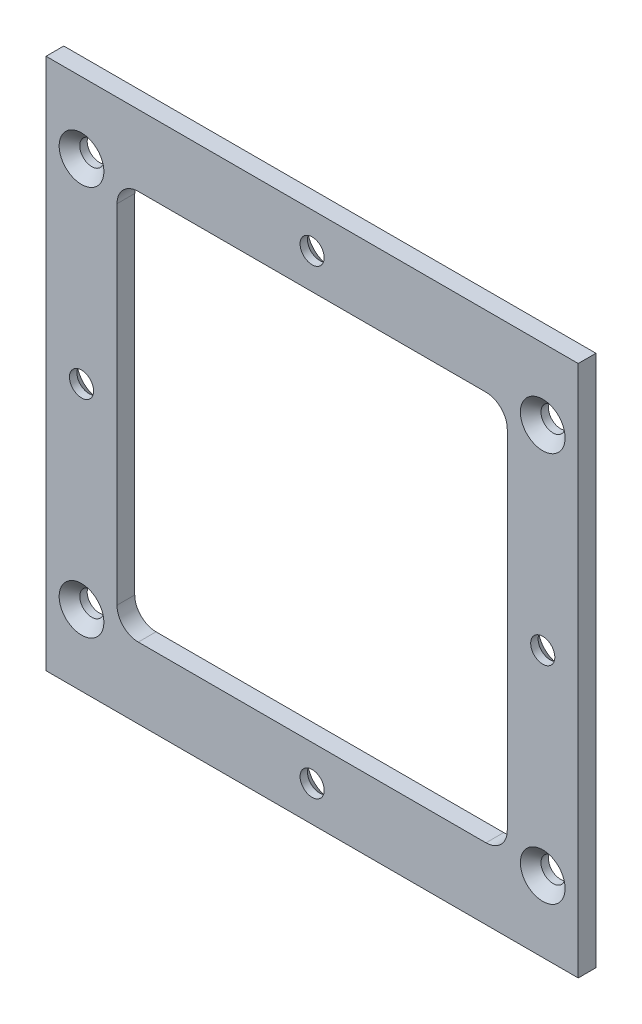
ISO-10303-21;
HEADER;
FILE_DESCRIPTION(('STEP AP214'),'2;1');
FILE_NAME('part.step','',(''),(''),'','','');
FILE_SCHEMA(('AUTOMOTIVE_DESIGN { 1 0 10303 214 1 1 1 1 }'));
ENDSEC;
DATA;
#1=APPLICATION_CONTEXT('core data for automotive mechanical design processes');
#2=APPLICATION_PROTOCOL_DEFINITION('international standard','automotive_design',2000,#1);
#3=PRODUCT_CONTEXT('',#1,'mechanical');
#4=PRODUCT('Part','Part','',(#3));
#5=PRODUCT_RELATED_PRODUCT_CATEGORY('part','',(#4));
#6=PRODUCT_DEFINITION_FORMATION('','',#4);
#7=PRODUCT_DEFINITION_CONTEXT('part definition',#1,'design');
#8=PRODUCT_DEFINITION('design','',#6,#7);
#9=PRODUCT_DEFINITION_SHAPE('','',#8);
#10=(LENGTH_UNIT() NAMED_UNIT(*) SI_UNIT(.MILLI.,.METRE.));
#11=(NAMED_UNIT(*) PLANE_ANGLE_UNIT() SI_UNIT($,.RADIAN.));
#12=(NAMED_UNIT(*) SI_UNIT($,.STERADIAN.) SOLID_ANGLE_UNIT());
#13=UNCERTAINTY_MEASURE_WITH_UNIT(LENGTH_MEASURE(1.E-05),#10,'distance_accuracy_value','');
#14=(GEOMETRIC_REPRESENTATION_CONTEXT(3) GLOBAL_UNCERTAINTY_ASSIGNED_CONTEXT((#13)) GLOBAL_UNIT_ASSIGNED_CONTEXT((#10,
#11,#12)) REPRESENTATION_CONTEXT('',''));
#15=CARTESIAN_POINT('',(0.,0.,0.));
#16=DIRECTION('',(0.,0.,1.));
#17=DIRECTION('',(1.,0.,0.));
#18=AXIS2_PLACEMENT_3D('',#15,#16,#17);
#19=CARTESIAN_POINT('',(37.5,75.,2.5));
#20=DIRECTION('',(0.,0.,1.));
#21=DIRECTION('',(1.,0.,0.));
#22=AXIS2_PLACEMENT_3D('',#19,#20,#21);
#23=PLANE('',#22);
#24=CARTESIAN_POINT('',(-32.5,37.5,2.5));
#25=DIRECTION('',(0.,0.,-1.));
#26=DIRECTION('',(-1.,0.,0.));
#27=AXIS2_PLACEMENT_3D('',#24,#25,#26);
#28=CIRCLE('',#27,1.7);
#29=CARTESIAN_POINT('',(-34.2,37.5,2.5));
#30=VERTEX_POINT('',#29);
#31=EDGE_CURVE('E367',#30,#30,#28,.T.);
#32=ORIENTED_EDGE('',*,*,#31,.T.);
#33=EDGE_LOOP('',(#32));
#34=FACE_BOUND('',#33,.T.);
#35=DIRECTION('',(0.,-1.,0.));
#36=VECTOR('',#35,1.);
#37=CARTESIAN_POINT('',(-27.5,13.,2.5));
#38=LINE('',#37,#36);
#39=CARTESIAN_POINT('',(-27.5,62.,2.5));
#40=VERTEX_POINT('',#39);
#41=CARTESIAN_POINT('',(-27.5,13.,2.5));
#42=VERTEX_POINT('',#41);
#43=EDGE_CURVE('E128',#40,#42,#38,.T.);
#44=ORIENTED_EDGE('',*,*,#43,.F.);
#45=CARTESIAN_POINT('',(-24.5,62.,2.5));
#46=DIRECTION('',(0.,0.,1.));
#47=DIRECTION('',(-1.,0.,0.));
#48=AXIS2_PLACEMENT_3D('',#45,#46,#47);
#49=CIRCLE('',#48,3.);
#50=CARTESIAN_POINT('',(-24.5,65.,2.5));
#51=VERTEX_POINT('',#50);
#52=EDGE_CURVE('E120',#51,#40,#49,.T.);
#53=ORIENTED_EDGE('',*,*,#52,.F.);
#54=DIRECTION('',(-1.,0.,0.));
#55=VECTOR('',#54,1.);
#56=CARTESIAN_POINT('',(-24.5,65.,2.5));
#57=LINE('',#56,#55);
#58=CARTESIAN_POINT('',(24.5,65.,2.5));
#59=VERTEX_POINT('',#58);
#60=EDGE_CURVE('E155',#59,#51,#57,.T.);
#61=ORIENTED_EDGE('',*,*,#60,.F.);
#62=CARTESIAN_POINT('',(24.5,62.,2.5));
#63=DIRECTION('',(0.,0.,1.));
#64=DIRECTION('',(-1.,0.,0.));
#65=AXIS2_PLACEMENT_3D('',#62,#63,#64);
#66=CIRCLE('',#65,2.99999999999999);
#67=CARTESIAN_POINT('',(27.5,62.,2.5));
#68=VERTEX_POINT('',#67);
#69=EDGE_CURVE('E153',#68,#59,#66,.T.);
#70=ORIENTED_EDGE('',*,*,#69,.F.);
#71=DIRECTION('',(0.,1.,0.));
#72=VECTOR('',#71,1.);
#73=CARTESIAN_POINT('',(27.5,13.,2.5));
#74=LINE('',#73,#72);
#75=CARTESIAN_POINT('',(27.5,13.,2.5));
#76=VERTEX_POINT('',#75);
#77=EDGE_CURVE('E151',#76,#68,#74,.T.);
#78=ORIENTED_EDGE('',*,*,#77,.F.);
#79=CARTESIAN_POINT('',(24.5,13.,2.5));
#80=DIRECTION('',(0.,0.,1.));
#81=DIRECTION('',(1.,0.,0.));
#82=AXIS2_PLACEMENT_3D('',#79,#80,#81);
#83=CIRCLE('',#82,3.);
#84=CARTESIAN_POINT('',(24.5,10.,2.5));
#85=VERTEX_POINT('',#84);
#86=EDGE_CURVE('E149',#85,#76,#83,.T.);
#87=ORIENTED_EDGE('',*,*,#86,.F.);
#88=DIRECTION('',(1.,0.,0.));
#89=VECTOR('',#88,1.);
#90=CARTESIAN_POINT('',(-24.5,10.,2.5));
#91=LINE('',#90,#89);
#92=CARTESIAN_POINT('',(-24.5,10.,2.5));
#93=VERTEX_POINT('',#92);
#94=EDGE_CURVE('E144',#93,#85,#91,.T.);
#95=ORIENTED_EDGE('',*,*,#94,.F.);
#96=CARTESIAN_POINT('',(-24.5,13.,2.5));
#97=DIRECTION('',(0.,0.,1.));
#98=DIRECTION('',(-1.,0.,0.));
#99=AXIS2_PLACEMENT_3D('',#96,#97,#98);
#100=CIRCLE('',#99,3.);
#101=EDGE_CURVE('E142',#42,#93,#100,.T.);
#102=ORIENTED_EDGE('',*,*,#101,.F.);
#103=EDGE_LOOP('',(#44,#53,#61,#70,#78,#87,#95,#102));
#104=FACE_BOUND('',#103,.T.);
#105=DIRECTION('',(0.,1.,0.));
#106=VECTOR('',#105,1.);
#107=CARTESIAN_POINT('',(37.5,0.,2.5));
#108=LINE('',#107,#106);
#109=CARTESIAN_POINT('',(37.5,0.,2.5));
#110=VERTEX_POINT('',#109);
#111=CARTESIAN_POINT('',(37.5,75.,2.5));
#112=VERTEX_POINT('',#111);
#113=EDGE_CURVE('E188',#110,#112,#108,.T.);
#114=ORIENTED_EDGE('',*,*,#113,.T.);
#115=DIRECTION('',(-1.,0.,0.));
#116=VECTOR('',#115,1.);
#117=CARTESIAN_POINT('',(37.5,75.,2.5));
#118=LINE('',#117,#116);
#119=CARTESIAN_POINT('',(-37.5,75.,2.5));
#120=VERTEX_POINT('',#119);
#121=EDGE_CURVE('E191',#112,#120,#118,.T.);
#122=ORIENTED_EDGE('',*,*,#121,.T.);
#123=DIRECTION('',(0.,-1.,0.));
#124=VECTOR('',#123,1.);
#125=CARTESIAN_POINT('',(-37.5,0.,2.5));
#126=LINE('',#125,#124);
#127=CARTESIAN_POINT('',(-37.5,0.,2.5));
#128=VERTEX_POINT('',#127);
#129=EDGE_CURVE('E194',#120,#128,#126,.T.);
#130=ORIENTED_EDGE('',*,*,#129,.T.);
#131=DIRECTION('',(1.,0.,0.));
#132=VECTOR('',#131,1.);
#133=CARTESIAN_POINT('',(37.5,0.,2.5));
#134=LINE('',#133,#132);
#135=EDGE_CURVE('E196',#128,#110,#134,.T.);
#136=ORIENTED_EDGE('',*,*,#135,.T.);
#137=EDGE_LOOP('',(#114,#122,#130,#136));
#138=FACE_BOUND('',#137,.T.);
#139=CARTESIAN_POINT('',(32.5,65.,2.5));
#140=DIRECTION('',(0.,0.,1.));
#141=DIRECTION('',(1.,0.,0.));
#142=AXIS2_PLACEMENT_3D('',#139,#140,#141);
#143=CIRCLE('',#142,3.15);
#144=CARTESIAN_POINT('',(35.65,65.,2.5));
#145=VERTEX_POINT('',#144);
#146=EDGE_CURVE('E414',#145,#145,#143,.T.);
#147=ORIENTED_EDGE('',*,*,#146,.F.);
#148=EDGE_LOOP('',(#147));
#149=FACE_BOUND('',#148,.T.);
#150=CARTESIAN_POINT('',(-32.5,65.,2.5));
#151=DIRECTION('',(0.,0.,1.));
#152=DIRECTION('',(1.,0.,0.));
#153=AXIS2_PLACEMENT_3D('',#150,#151,#152);
#154=CIRCLE('',#153,3.15);
#155=CARTESIAN_POINT('',(-29.35,65.,2.5));
#156=VERTEX_POINT('',#155);
#157=EDGE_CURVE('E405',#156,#156,#154,.T.);
#158=ORIENTED_EDGE('',*,*,#157,.F.);
#159=EDGE_LOOP('',(#158));
#160=FACE_BOUND('',#159,.T.);
#161=CARTESIAN_POINT('',(-32.5,10.,2.5));
#162=DIRECTION('',(0.,0.,1.));
#163=DIRECTION('',(1.,0.,0.));
#164=AXIS2_PLACEMENT_3D('',#161,#162,#163);
#165=CIRCLE('',#164,3.15);
#166=CARTESIAN_POINT('',(-29.35,10.,2.5));
#167=VERTEX_POINT('',#166);
#168=EDGE_CURVE('E396',#167,#167,#165,.T.);
#169=ORIENTED_EDGE('',*,*,#168,.F.);
#170=EDGE_LOOP('',(#169));
#171=FACE_BOUND('',#170,.T.);
#172=CARTESIAN_POINT('',(32.5,10.,2.5));
#173=DIRECTION('',(0.,0.,1.));
#174=DIRECTION('',(1.,0.,0.));
#175=AXIS2_PLACEMENT_3D('',#172,#173,#174);
#176=CIRCLE('',#175,3.15);
#177=CARTESIAN_POINT('',(35.65,10.,2.5));
#178=VERTEX_POINT('',#177);
#179=EDGE_CURVE('E387',#178,#178,#176,.T.);
#180=ORIENTED_EDGE('',*,*,#179,.F.);
#181=EDGE_LOOP('',(#180));
#182=FACE_BOUND('',#181,.T.);
#183=CARTESIAN_POINT('',(0.,70.,2.5));
#184=DIRECTION('',(0.,0.,-1.));
#185=DIRECTION('',(-1.,0.,0.));
#186=AXIS2_PLACEMENT_3D('',#183,#184,#185);
#187=CIRCLE('',#186,1.7);
#188=CARTESIAN_POINT('',(-1.7,70.,2.5));
#189=VERTEX_POINT('',#188);
#190=EDGE_CURVE('E384',#189,#189,#187,.T.);
#191=ORIENTED_EDGE('',*,*,#190,.T.);
#192=EDGE_LOOP('',(#191));
#193=FACE_BOUND('',#192,.T.);
#194=CARTESIAN_POINT('',(32.5,37.5,2.5));
#195=DIRECTION('',(0.,0.,-1.));
#196=DIRECTION('',(-1.,0.,0.));
#197=AXIS2_PLACEMENT_3D('',#194,#195,#196);
#198=CIRCLE('',#197,1.7);
#199=CARTESIAN_POINT('',(30.8,37.5,2.5));
#200=VERTEX_POINT('',#199);
#201=EDGE_CURVE('E375',#200,#200,#198,.T.);
#202=ORIENTED_EDGE('',*,*,#201,.T.);
#203=EDGE_LOOP('',(#202));
#204=FACE_BOUND('',#203,.T.);
#205=CARTESIAN_POINT('',(0.,5.,2.5));
#206=DIRECTION('',(0.,0.,-1.));
#207=DIRECTION('',(-1.,0.,0.));
#208=AXIS2_PLACEMENT_3D('',#205,#206,#207);
#209=CIRCLE('',#208,1.7);
#210=CARTESIAN_POINT('',(-1.7,5.,2.5));
#211=VERTEX_POINT('',#210);
#212=EDGE_CURVE('E356',#211,#211,#209,.T.);
#213=ORIENTED_EDGE('',*,*,#212,.T.);
#214=EDGE_LOOP('',(#213));
#215=FACE_BOUND('',#214,.T.);
#216=ADVANCED_FACE('F31',(#34,#104,#138,#149,#160,#171,#182,#193,#204,#215),#23,.T.);
#217=CARTESIAN_POINT('',(37.5,75.,0.));
#218=DIRECTION('',(0.,0.,1.));
#219=DIRECTION('',(1.,0.,0.));
#220=AXIS2_PLACEMENT_3D('',#217,#218,#219);
#221=PLANE('',#220);
#222=CARTESIAN_POINT('',(0.,5.,0.));
#223=DIRECTION('',(0.,0.,-1.));
#224=DIRECTION('',(-1.,0.,0.));
#225=AXIS2_PLACEMENT_3D('',#222,#223,#224);
#226=CIRCLE('',#225,3.15);
#227=CARTESIAN_POINT('',(-3.15,5.,0.));
#228=VERTEX_POINT('',#227);
#229=EDGE_CURVE('E354',#228,#228,#226,.T.);
#230=ORIENTED_EDGE('',*,*,#229,.F.);
#231=EDGE_LOOP('',(#230));
#232=FACE_BOUND('',#231,.T.);
#233=CARTESIAN_POINT('',(-24.5,62.,0.));
#234=DIRECTION('',(0.,0.,1.));
#235=DIRECTION('',(-1.,0.,0.));
#236=AXIS2_PLACEMENT_3D('',#233,#234,#235);
#237=CIRCLE('',#236,3.);
#238=CARTESIAN_POINT('',(-24.5,65.,0.));
#239=VERTEX_POINT('',#238);
#240=CARTESIAN_POINT('',(-27.5,62.,0.));
#241=VERTEX_POINT('',#240);
#242=EDGE_CURVE('E54',#239,#241,#237,.T.);
#243=ORIENTED_EDGE('',*,*,#242,.T.);
#244=DIRECTION('',(0.,-1.,0.));
#245=VECTOR('',#244,1.);
#246=CARTESIAN_POINT('',(-27.5,13.,0.));
#247=LINE('',#246,#245);
#248=CARTESIAN_POINT('',(-27.5,13.,0.));
#249=VERTEX_POINT('',#248);
#250=EDGE_CURVE('E135',#241,#249,#247,.T.);
#251=ORIENTED_EDGE('',*,*,#250,.T.);
#252=CARTESIAN_POINT('',(-24.5,13.,0.));
#253=DIRECTION('',(0.,0.,1.));
#254=DIRECTION('',(-1.,0.,0.));
#255=AXIS2_PLACEMENT_3D('',#252,#253,#254);
#256=CIRCLE('',#255,3.);
#257=CARTESIAN_POINT('',(-24.5,10.,0.));
#258=VERTEX_POINT('',#257);
#259=EDGE_CURVE('E160',#249,#258,#256,.T.);
#260=ORIENTED_EDGE('',*,*,#259,.T.);
#261=DIRECTION('',(1.,0.,0.));
#262=VECTOR('',#261,1.);
#263=CARTESIAN_POINT('',(-24.5,10.,0.));
#264=LINE('',#263,#262);
#265=CARTESIAN_POINT('',(24.5,10.,0.));
#266=VERTEX_POINT('',#265);
#267=EDGE_CURVE('E163',#258,#266,#264,.T.);
#268=ORIENTED_EDGE('',*,*,#267,.T.);
#269=CARTESIAN_POINT('',(24.5,13.,0.));
#270=DIRECTION('',(0.,0.,1.));
#271=DIRECTION('',(1.,0.,0.));
#272=AXIS2_PLACEMENT_3D('',#269,#270,#271);
#273=CIRCLE('',#272,3.);
#274=CARTESIAN_POINT('',(27.5,13.,0.));
#275=VERTEX_POINT('',#274);
#276=EDGE_CURVE('E166',#266,#275,#273,.T.);
#277=ORIENTED_EDGE('',*,*,#276,.T.);
#278=DIRECTION('',(0.,1.,0.));
#279=VECTOR('',#278,1.);
#280=CARTESIAN_POINT('',(27.5,13.,0.));
#281=LINE('',#280,#279);
#282=CARTESIAN_POINT('',(27.5,62.,0.));
#283=VERTEX_POINT('',#282);
#284=EDGE_CURVE('E169',#275,#283,#281,.T.);
#285=ORIENTED_EDGE('',*,*,#284,.T.);
#286=CARTESIAN_POINT('',(24.5,62.,0.));
#287=DIRECTION('',(0.,0.,1.));
#288=DIRECTION('',(-1.,0.,0.));
#289=AXIS2_PLACEMENT_3D('',#286,#287,#288);
#290=CIRCLE('',#289,2.99999999999999);
#291=CARTESIAN_POINT('',(24.5,65.,0.));
#292=VERTEX_POINT('',#291);
#293=EDGE_CURVE('E172',#283,#292,#290,.T.);
#294=ORIENTED_EDGE('',*,*,#293,.T.);
#295=DIRECTION('',(-1.,0.,0.));
#296=VECTOR('',#295,1.);
#297=CARTESIAN_POINT('',(-24.5,65.,0.));
#298=LINE('',#297,#296);
#299=EDGE_CURVE('E129',#292,#239,#298,.T.);
#300=ORIENTED_EDGE('',*,*,#299,.T.);
#301=EDGE_LOOP('',(#243,#251,#260,#268,#277,#285,#294,#300));
#302=FACE_BOUND('',#301,.T.);
#303=DIRECTION('',(0.,1.,0.));
#304=VECTOR('',#303,1.);
#305=CARTESIAN_POINT('',(37.5,0.,0.));
#306=LINE('',#305,#304);
#307=CARTESIAN_POINT('',(37.5,0.,0.));
#308=VERTEX_POINT('',#307);
#309=CARTESIAN_POINT('',(37.5,75.,0.));
#310=VERTEX_POINT('',#309);
#311=EDGE_CURVE('E136',#308,#310,#306,.T.);
#312=ORIENTED_EDGE('',*,*,#311,.F.);
#313=DIRECTION('',(1.,0.,0.));
#314=VECTOR('',#313,1.);
#315=CARTESIAN_POINT('',(37.5,0.,0.));
#316=LINE('',#315,#314);
#317=CARTESIAN_POINT('',(-37.5,0.,0.));
#318=VERTEX_POINT('',#317);
#319=EDGE_CURVE('E192',#318,#308,#316,.T.);
#320=ORIENTED_EDGE('',*,*,#319,.F.);
#321=DIRECTION('',(0.,-1.,0.));
#322=VECTOR('',#321,1.);
#323=CARTESIAN_POINT('',(-37.5,0.,0.));
#324=LINE('',#323,#322);
#325=CARTESIAN_POINT('',(-37.5,75.,0.));
#326=VERTEX_POINT('',#325);
#327=EDGE_CURVE('E203',#326,#318,#324,.T.);
#328=ORIENTED_EDGE('',*,*,#327,.F.);
#329=DIRECTION('',(-1.,0.,0.));
#330=VECTOR('',#329,1.);
#331=CARTESIAN_POINT('',(37.5,75.,0.));
#332=LINE('',#331,#330);
#333=EDGE_CURVE('E201',#310,#326,#332,.T.);
#334=ORIENTED_EDGE('',*,*,#333,.F.);
#335=EDGE_LOOP('',(#312,#320,#328,#334));
#336=FACE_BOUND('',#335,.T.);
#337=CARTESIAN_POINT('',(32.5,65.,0.));
#338=DIRECTION('',(0.,0.,1.));
#339=DIRECTION('',(1.,0.,0.));
#340=AXIS2_PLACEMENT_3D('',#337,#338,#339);
#341=CIRCLE('',#340,1.7);
#342=CARTESIAN_POINT('',(34.2,65.,0.));
#343=VERTEX_POINT('',#342);
#344=EDGE_CURVE('E158',#343,#343,#341,.T.);
#345=ORIENTED_EDGE('',*,*,#344,.T.);
#346=EDGE_LOOP('',(#345));
#347=FACE_BOUND('',#346,.T.);
#348=CARTESIAN_POINT('',(-32.5,65.,0.));
#349=DIRECTION('',(0.,0.,1.));
#350=DIRECTION('',(1.,0.,0.));
#351=AXIS2_PLACEMENT_3D('',#348,#349,#350);
#352=CIRCLE('',#351,1.7);
#353=CARTESIAN_POINT('',(-30.8,65.,0.));
#354=VERTEX_POINT('',#353);
#355=EDGE_CURVE('E411',#354,#354,#352,.T.);
#356=ORIENTED_EDGE('',*,*,#355,.T.);
#357=EDGE_LOOP('',(#356));
#358=FACE_BOUND('',#357,.T.);
#359=CARTESIAN_POINT('',(-32.5,10.,0.));
#360=DIRECTION('',(0.,0.,1.));
#361=DIRECTION('',(1.,0.,0.));
#362=AXIS2_PLACEMENT_3D('',#359,#360,#361);
#363=CIRCLE('',#362,1.7);
#364=CARTESIAN_POINT('',(-30.8,10.,0.));
#365=VERTEX_POINT('',#364);
#366=EDGE_CURVE('E402',#365,#365,#363,.T.);
#367=ORIENTED_EDGE('',*,*,#366,.T.);
#368=EDGE_LOOP('',(#367));
#369=FACE_BOUND('',#368,.T.);
#370=CARTESIAN_POINT('',(32.5,10.,0.));
#371=DIRECTION('',(0.,0.,1.));
#372=DIRECTION('',(1.,0.,0.));
#373=AXIS2_PLACEMENT_3D('',#370,#371,#372);
#374=CIRCLE('',#373,1.7);
#375=CARTESIAN_POINT('',(34.2,10.,0.));
#376=VERTEX_POINT('',#375);
#377=EDGE_CURVE('E393',#376,#376,#374,.T.);
#378=ORIENTED_EDGE('',*,*,#377,.T.);
#379=EDGE_LOOP('',(#378));
#380=FACE_BOUND('',#379,.T.);
#381=CARTESIAN_POINT('',(0.,70.,0.));
#382=DIRECTION('',(0.,0.,-1.));
#383=DIRECTION('',(-1.,0.,0.));
#384=AXIS2_PLACEMENT_3D('',#381,#382,#383);
#385=CIRCLE('',#384,3.15);
#386=CARTESIAN_POINT('',(-3.15000000000001,70.,0.));
#387=VERTEX_POINT('',#386);
#388=EDGE_CURVE('E378',#387,#387,#385,.T.);
#389=ORIENTED_EDGE('',*,*,#388,.F.);
#390=EDGE_LOOP('',(#389));
#391=FACE_BOUND('',#390,.T.);
#392=CARTESIAN_POINT('',(32.5,37.5,0.));
#393=DIRECTION('',(0.,0.,-1.));
#394=DIRECTION('',(-1.,0.,0.));
#395=AXIS2_PLACEMENT_3D('',#392,#393,#394);
#396=CIRCLE('',#395,3.15);
#397=CARTESIAN_POINT('',(29.35,37.5,0.));
#398=VERTEX_POINT('',#397);
#399=EDGE_CURVE('E369',#398,#398,#396,.T.);
#400=ORIENTED_EDGE('',*,*,#399,.F.);
#401=EDGE_LOOP('',(#400));
#402=FACE_BOUND('',#401,.T.);
#403=CARTESIAN_POINT('',(-32.5,37.5,0.));
#404=DIRECTION('',(0.,0.,-1.));
#405=DIRECTION('',(-1.,0.,0.));
#406=AXIS2_PLACEMENT_3D('',#403,#404,#405);
#407=CIRCLE('',#406,3.15);
#408=CARTESIAN_POINT('',(-35.65,37.5,0.));
#409=VERTEX_POINT('',#408);
#410=EDGE_CURVE('E361',#409,#409,#407,.T.);
#411=ORIENTED_EDGE('',*,*,#410,.F.);
#412=EDGE_LOOP('',(#411));
#413=FACE_BOUND('',#412,.T.);
#414=ADVANCED_FACE('F221',(#232,#302,#336,#347,#358,#369,#380,#391,#402,#413),#221,.F.);
#415=CARTESIAN_POINT('',(37.5,0.,2.5));
#416=DIRECTION('',(-1.,0.,0.));
#417=DIRECTION('',(0.,0.,1.));
#418=AXIS2_PLACEMENT_3D('',#415,#416,#417);
#419=PLANE('',#418);
#420=ORIENTED_EDGE('',*,*,#311,.T.);
#421=DIRECTION('',(0.,0.,-1.));
#422=VECTOR('',#421,1.);
#423=CARTESIAN_POINT('',(37.5,75.,2.5));
#424=LINE('',#423,#422);
#425=EDGE_CURVE('E11',#112,#310,#424,.T.);
#426=ORIENTED_EDGE('',*,*,#425,.F.);
#427=ORIENTED_EDGE('',*,*,#113,.F.);
#428=DIRECTION('',(0.,0.,-1.));
#429=VECTOR('',#428,1.);
#430=CARTESIAN_POINT('',(37.5,0.,2.5));
#431=LINE('',#430,#429);
#432=EDGE_CURVE('E198',#110,#308,#431,.T.);
#433=ORIENTED_EDGE('',*,*,#432,.T.);
#434=EDGE_LOOP('',(#420,#426,#427,#433));
#435=FACE_BOUND('',#434,.T.);
#436=ADVANCED_FACE('F33',(#435),#419,.F.);
#437=CARTESIAN_POINT('',(37.5,75.,2.5));
#438=DIRECTION('',(0.,-1.,0.));
#439=DIRECTION('',(0.,0.,-1.));
#440=AXIS2_PLACEMENT_3D('',#437,#438,#439);
#441=PLANE('',#440);
#442=ORIENTED_EDGE('',*,*,#333,.T.);
#443=DIRECTION('',(0.,0.,-1.));
#444=VECTOR('',#443,1.);
#445=CARTESIAN_POINT('',(-37.5,75.,2.5));
#446=LINE('',#445,#444);
#447=EDGE_CURVE('E39',#120,#326,#446,.T.);
#448=ORIENTED_EDGE('',*,*,#447,.F.);
#449=ORIENTED_EDGE('',*,*,#121,.F.);
#450=ORIENTED_EDGE('',*,*,#425,.T.);
#451=EDGE_LOOP('',(#442,#448,#449,#450));
#452=FACE_BOUND('',#451,.T.);
#453=ADVANCED_FACE('F231',(#452),#441,.F.);
#454=CARTESIAN_POINT('',(-37.5,0.,2.5));
#455=DIRECTION('',(1.,0.,0.));
#456=DIRECTION('',(0.,0.,-1.));
#457=AXIS2_PLACEMENT_3D('',#454,#455,#456);
#458=PLANE('',#457);
#459=ORIENTED_EDGE('',*,*,#327,.T.);
#460=DIRECTION('',(0.,0.,-1.));
#461=VECTOR('',#460,1.);
#462=CARTESIAN_POINT('',(-37.5,0.,2.5));
#463=LINE('',#462,#461);
#464=EDGE_CURVE('E208',#128,#318,#463,.T.);
#465=ORIENTED_EDGE('',*,*,#464,.F.);
#466=ORIENTED_EDGE('',*,*,#129,.F.);
#467=ORIENTED_EDGE('',*,*,#447,.T.);
#468=EDGE_LOOP('',(#459,#465,#466,#467));
#469=FACE_BOUND('',#468,.T.);
#470=ADVANCED_FACE('F215',(#469),#458,.F.);
#471=CARTESIAN_POINT('',(37.5,0.,2.5));
#472=DIRECTION('',(0.,1.,0.));
#473=DIRECTION('',(0.,0.,1.));
#474=AXIS2_PLACEMENT_3D('',#471,#472,#473);
#475=PLANE('',#474);
#476=ORIENTED_EDGE('',*,*,#319,.T.);
#477=ORIENTED_EDGE('',*,*,#432,.F.);
#478=ORIENTED_EDGE('',*,*,#135,.F.);
#479=ORIENTED_EDGE('',*,*,#464,.T.);
#480=EDGE_LOOP('',(#476,#477,#478,#479));
#481=FACE_BOUND('',#480,.T.);
#482=ADVANCED_FACE('F225',(#481),#475,.F.);
#483=CARTESIAN_POINT('',(-24.5,62.,2.5));
#484=DIRECTION('',(0.,0.,-1.));
#485=DIRECTION('',(-1.,0.,0.));
#486=AXIS2_PLACEMENT_3D('',#483,#484,#485);
#487=CYLINDRICAL_SURFACE('',#486,3.);
#488=ORIENTED_EDGE('',*,*,#242,.F.);
#489=DIRECTION('',(0.,0.,-1.));
#490=VECTOR('',#489,1.);
#491=CARTESIAN_POINT('',(-24.5,65.,2.5));
#492=LINE('',#491,#490);
#493=EDGE_CURVE('E124',#51,#239,#492,.T.);
#494=ORIENTED_EDGE('',*,*,#493,.F.);
#495=ORIENTED_EDGE('',*,*,#52,.T.);
#496=DIRECTION('',(0.,0.,-1.));
#497=VECTOR('',#496,1.);
#498=CARTESIAN_POINT('',(-27.5,62.,2.5));
#499=LINE('',#498,#497);
#500=EDGE_CURVE('E123',#40,#241,#499,.T.);
#501=ORIENTED_EDGE('',*,*,#500,.T.);
#502=EDGE_LOOP('',(#488,#494,#495,#501));
#503=FACE_BOUND('',#502,.T.);
#504=ADVANCED_FACE('F122',(#503),#487,.F.);
#505=CARTESIAN_POINT('',(-27.5,13.,2.5));
#506=DIRECTION('',(1.,0.,0.));
#507=DIRECTION('',(0.,1.,0.));
#508=AXIS2_PLACEMENT_3D('',#505,#506,#507);
#509=PLANE('',#508);
#510=ORIENTED_EDGE('',*,*,#250,.F.);
#511=ORIENTED_EDGE('',*,*,#500,.F.);
#512=ORIENTED_EDGE('',*,*,#43,.T.);
#513=DIRECTION('',(0.,0.,-1.));
#514=VECTOR('',#513,1.);
#515=CARTESIAN_POINT('',(-27.5,13.,2.5));
#516=LINE('',#515,#514);
#517=EDGE_CURVE('E137',#42,#249,#516,.T.);
#518=ORIENTED_EDGE('',*,*,#517,.T.);
#519=EDGE_LOOP('',(#510,#511,#512,#518));
#520=FACE_BOUND('',#519,.T.);
#521=ADVANCED_FACE('F132',(#520),#509,.T.);
#522=CARTESIAN_POINT('',(-24.5,13.,2.5));
#523=DIRECTION('',(0.,0.,-1.));
#524=DIRECTION('',(-1.,0.,0.));
#525=AXIS2_PLACEMENT_3D('',#522,#523,#524);
#526=CYLINDRICAL_SURFACE('',#525,3.);
#527=ORIENTED_EDGE('',*,*,#259,.F.);
#528=ORIENTED_EDGE('',*,*,#517,.F.);
#529=ORIENTED_EDGE('',*,*,#101,.T.);
#530=DIRECTION('',(0.,0.,-1.));
#531=VECTOR('',#530,1.);
#532=CARTESIAN_POINT('',(-24.5,10.,2.5));
#533=LINE('',#532,#531);
#534=EDGE_CURVE('E185',#93,#258,#533,.T.);
#535=ORIENTED_EDGE('',*,*,#534,.T.);
#536=EDGE_LOOP('',(#527,#528,#529,#535));
#537=FACE_BOUND('',#536,.T.);
#538=ADVANCED_FACE('F257',(#537),#526,.F.);
#539=CARTESIAN_POINT('',(-24.5,10.,2.5));
#540=DIRECTION('',(0.,1.,0.));
#541=DIRECTION('',(-1.,0.,0.));
#542=AXIS2_PLACEMENT_3D('',#539,#540,#541);
#543=PLANE('',#542);
#544=ORIENTED_EDGE('',*,*,#267,.F.);
#545=ORIENTED_EDGE('',*,*,#534,.F.);
#546=ORIENTED_EDGE('',*,*,#94,.T.);
#547=DIRECTION('',(0.,0.,-1.));
#548=VECTOR('',#547,1.);
#549=CARTESIAN_POINT('',(24.5,10.,2.5));
#550=LINE('',#549,#548);
#551=EDGE_CURVE('E183',#85,#266,#550,.T.);
#552=ORIENTED_EDGE('',*,*,#551,.T.);
#553=EDGE_LOOP('',(#544,#545,#546,#552));
#554=FACE_BOUND('',#553,.T.);
#555=ADVANCED_FACE('F261',(#554),#543,.T.);
#556=CARTESIAN_POINT('',(24.5,13.,2.5));
#557=DIRECTION('',(0.,0.,-1.));
#558=DIRECTION('',(-1.,0.,0.));
#559=AXIS2_PLACEMENT_3D('',#556,#557,#558);
#560=CYLINDRICAL_SURFACE('',#559,3.);
#561=ORIENTED_EDGE('',*,*,#276,.F.);
#562=ORIENTED_EDGE('',*,*,#551,.F.);
#563=ORIENTED_EDGE('',*,*,#86,.T.);
#564=DIRECTION('',(0.,0.,-1.));
#565=VECTOR('',#564,1.);
#566=CARTESIAN_POINT('',(27.5,13.,2.5));
#567=LINE('',#566,#565);
#568=EDGE_CURVE('E181',#76,#275,#567,.T.);
#569=ORIENTED_EDGE('',*,*,#568,.T.);
#570=EDGE_LOOP('',(#561,#562,#563,#569));
#571=FACE_BOUND('',#570,.T.);
#572=ADVANCED_FACE('F267',(#571),#560,.F.);
#573=CARTESIAN_POINT('',(27.5,13.,2.5));
#574=DIRECTION('',(-1.,0.,0.));
#575=DIRECTION('',(0.,0.,1.));
#576=AXIS2_PLACEMENT_3D('',#573,#574,#575);
#577=PLANE('',#576);
#578=ORIENTED_EDGE('',*,*,#284,.F.);
#579=ORIENTED_EDGE('',*,*,#568,.F.);
#580=ORIENTED_EDGE('',*,*,#77,.T.);
#581=DIRECTION('',(0.,0.,-1.));
#582=VECTOR('',#581,1.);
#583=CARTESIAN_POINT('',(27.5,62.,2.5));
#584=LINE('',#583,#582);
#585=EDGE_CURVE('E179',#68,#283,#584,.T.);
#586=ORIENTED_EDGE('',*,*,#585,.T.);
#587=EDGE_LOOP('',(#578,#579,#580,#586));
#588=FACE_BOUND('',#587,.T.);
#589=ADVANCED_FACE('F271',(#588),#577,.T.);
#590=CARTESIAN_POINT('',(24.5,62.,2.5));
#591=DIRECTION('',(0.,0.,-1.));
#592=DIRECTION('',(-1.,0.,0.));
#593=AXIS2_PLACEMENT_3D('',#590,#591,#592);
#594=CYLINDRICAL_SURFACE('',#593,2.99999999999999);
#595=ORIENTED_EDGE('',*,*,#293,.F.);
#596=ORIENTED_EDGE('',*,*,#585,.F.);
#597=ORIENTED_EDGE('',*,*,#69,.T.);
#598=DIRECTION('',(0.,0.,-1.));
#599=VECTOR('',#598,1.);
#600=CARTESIAN_POINT('',(24.5,65.,2.5));
#601=LINE('',#600,#599);
#602=EDGE_CURVE('E46',#59,#292,#601,.T.);
#603=ORIENTED_EDGE('',*,*,#602,.T.);
#604=EDGE_LOOP('',(#595,#596,#597,#603));
#605=FACE_BOUND('',#604,.T.);
#606=ADVANCED_FACE('F275',(#605),#594,.F.);
#607=CARTESIAN_POINT('',(-24.5,65.,2.5));
#608=DIRECTION('',(0.,-1.,0.));
#609=DIRECTION('',(1.,0.,0.));
#610=AXIS2_PLACEMENT_3D('',#607,#608,#609);
#611=PLANE('',#610);
#612=ORIENTED_EDGE('',*,*,#299,.F.);
#613=ORIENTED_EDGE('',*,*,#602,.F.);
#614=ORIENTED_EDGE('',*,*,#60,.T.);
#615=ORIENTED_EDGE('',*,*,#493,.T.);
#616=EDGE_LOOP('',(#612,#613,#614,#615));
#617=FACE_BOUND('',#616,.T.);
#618=ADVANCED_FACE('F279',(#617),#611,.T.);
#619=CARTESIAN_POINT('',(32.5,65.,2.5));
#620=DIRECTION('',(0.,0.,1.));
#621=DIRECTION('',(1.,0.,0.));
#622=AXIS2_PLACEMENT_3D('',#619,#620,#621);
#623=CYLINDRICAL_SURFACE('',#622,1.7);
#624=ORIENTED_EDGE('',*,*,#344,.F.);
#625=EDGE_LOOP('',(#624));
#626=FACE_BOUND('',#625,.T.);
#627=CARTESIAN_POINT('',(32.5,65.,1.05));
#628=DIRECTION('',(0.,0.,1.));
#629=DIRECTION('',(1.,0.,0.));
#630=AXIS2_PLACEMENT_3D('',#627,#628,#629);
#631=CIRCLE('',#630,1.7);
#632=CARTESIAN_POINT('',(34.2,65.,1.05));
#633=VERTEX_POINT('',#632);
#634=EDGE_CURVE('E417',#633,#633,#631,.T.);
#635=ORIENTED_EDGE('',*,*,#634,.T.);
#636=EDGE_LOOP('',(#635));
#637=FACE_BOUND('',#636,.T.);
#638=ADVANCED_FACE('F283',(#626,#637),#623,.F.);
#639=CARTESIAN_POINT('',(32.5,65.,2.5));
#640=DIRECTION('',(0.,0.,1.));
#641=DIRECTION('',(1.,0.,0.));
#642=AXIS2_PLACEMENT_3D('',#639,#640,#641);
#643=CONICAL_SURFACE('',#642,3.15,0.785398163397448);
#644=ORIENTED_EDGE('',*,*,#634,.F.);
#645=EDGE_LOOP('',(#644));
#646=FACE_BOUND('',#645,.T.);
#647=ORIENTED_EDGE('',*,*,#146,.T.);
#648=EDGE_LOOP('',(#647));
#649=FACE_BOUND('',#648,.T.);
#650=ADVANCED_FACE('F286',(#646,#649),#643,.F.);
#651=CARTESIAN_POINT('',(-32.5,65.,2.5));
#652=DIRECTION('',(0.,0.,1.));
#653=DIRECTION('',(1.,0.,0.));
#654=AXIS2_PLACEMENT_3D('',#651,#652,#653);
#655=CYLINDRICAL_SURFACE('',#654,1.7);
#656=ORIENTED_EDGE('',*,*,#355,.F.);
#657=EDGE_LOOP('',(#656));
#658=FACE_BOUND('',#657,.T.);
#659=CARTESIAN_POINT('',(-32.5,65.,1.05));
#660=DIRECTION('',(0.,0.,1.));
#661=DIRECTION('',(1.,0.,0.));
#662=AXIS2_PLACEMENT_3D('',#659,#660,#661);
#663=CIRCLE('',#662,1.7);
#664=CARTESIAN_POINT('',(-30.8,65.,1.05));
#665=VERTEX_POINT('',#664);
#666=EDGE_CURVE('E408',#665,#665,#663,.T.);
#667=ORIENTED_EDGE('',*,*,#666,.T.);
#668=EDGE_LOOP('',(#667));
#669=FACE_BOUND('',#668,.T.);
#670=ADVANCED_FACE('F290',(#658,#669),#655,.F.);
#671=CARTESIAN_POINT('',(-32.5,65.,2.5));
#672=DIRECTION('',(0.,0.,1.));
#673=DIRECTION('',(1.,0.,0.));
#674=AXIS2_PLACEMENT_3D('',#671,#672,#673);
#675=CONICAL_SURFACE('',#674,3.15,0.785398163397448);
#676=ORIENTED_EDGE('',*,*,#666,.F.);
#677=EDGE_LOOP('',(#676));
#678=FACE_BOUND('',#677,.T.);
#679=ORIENTED_EDGE('',*,*,#157,.T.);
#680=EDGE_LOOP('',(#679));
#681=FACE_BOUND('',#680,.T.);
#682=ADVANCED_FACE('F294',(#678,#681),#675,.F.);
#683=CARTESIAN_POINT('',(-32.5,10.,2.5));
#684=DIRECTION('',(0.,0.,1.));
#685=DIRECTION('',(1.,0.,0.));
#686=AXIS2_PLACEMENT_3D('',#683,#684,#685);
#687=CYLINDRICAL_SURFACE('',#686,1.7);
#688=ORIENTED_EDGE('',*,*,#366,.F.);
#689=EDGE_LOOP('',(#688));
#690=FACE_BOUND('',#689,.T.);
#691=CARTESIAN_POINT('',(-32.5,10.,1.05));
#692=DIRECTION('',(0.,0.,1.));
#693=DIRECTION('',(1.,0.,0.));
#694=AXIS2_PLACEMENT_3D('',#691,#692,#693);
#695=CIRCLE('',#694,1.7);
#696=CARTESIAN_POINT('',(-30.8,10.,1.05));
#697=VERTEX_POINT('',#696);
#698=EDGE_CURVE('E399',#697,#697,#695,.T.);
#699=ORIENTED_EDGE('',*,*,#698,.T.);
#700=EDGE_LOOP('',(#699));
#701=FACE_BOUND('',#700,.T.);
#702=ADVANCED_FACE('F298',(#690,#701),#687,.F.);
#703=CARTESIAN_POINT('',(-32.5,10.,2.5));
#704=DIRECTION('',(0.,0.,1.));
#705=DIRECTION('',(1.,0.,0.));
#706=AXIS2_PLACEMENT_3D('',#703,#704,#705);
#707=CONICAL_SURFACE('',#706,3.15,0.785398163397448);
#708=ORIENTED_EDGE('',*,*,#698,.F.);
#709=EDGE_LOOP('',(#708));
#710=FACE_BOUND('',#709,.T.);
#711=ORIENTED_EDGE('',*,*,#168,.T.);
#712=EDGE_LOOP('',(#711));
#713=FACE_BOUND('',#712,.T.);
#714=ADVANCED_FACE('F302',(#710,#713),#707,.F.);
#715=CARTESIAN_POINT('',(32.5,10.,2.5));
#716=DIRECTION('',(0.,0.,1.));
#717=DIRECTION('',(1.,0.,0.));
#718=AXIS2_PLACEMENT_3D('',#715,#716,#717);
#719=CYLINDRICAL_SURFACE('',#718,1.7);
#720=ORIENTED_EDGE('',*,*,#377,.F.);
#721=EDGE_LOOP('',(#720));
#722=FACE_BOUND('',#721,.T.);
#723=CARTESIAN_POINT('',(32.5,10.,1.05));
#724=DIRECTION('',(0.,0.,1.));
#725=DIRECTION('',(1.,0.,0.));
#726=AXIS2_PLACEMENT_3D('',#723,#724,#725);
#727=CIRCLE('',#726,1.7);
#728=CARTESIAN_POINT('',(34.2,10.,1.05));
#729=VERTEX_POINT('',#728);
#730=EDGE_CURVE('E390',#729,#729,#727,.T.);
#731=ORIENTED_EDGE('',*,*,#730,.T.);
#732=EDGE_LOOP('',(#731));
#733=FACE_BOUND('',#732,.T.);
#734=ADVANCED_FACE('F306',(#722,#733),#719,.F.);
#735=CARTESIAN_POINT('',(32.5,10.,2.5));
#736=DIRECTION('',(0.,0.,1.));
#737=DIRECTION('',(1.,0.,0.));
#738=AXIS2_PLACEMENT_3D('',#735,#736,#737);
#739=CONICAL_SURFACE('',#738,3.15,0.785398163397448);
#740=ORIENTED_EDGE('',*,*,#730,.F.);
#741=EDGE_LOOP('',(#740));
#742=FACE_BOUND('',#741,.T.);
#743=ORIENTED_EDGE('',*,*,#179,.T.);
#744=EDGE_LOOP('',(#743));
#745=FACE_BOUND('',#744,.T.);
#746=ADVANCED_FACE('F310',(#742,#745),#739,.F.);
#747=CARTESIAN_POINT('',(0.,70.,0.));
#748=DIRECTION('',(0.,0.,-1.));
#749=DIRECTION('',(-1.,0.,0.));
#750=AXIS2_PLACEMENT_3D('',#747,#748,#749);
#751=CYLINDRICAL_SURFACE('',#750,1.7);
#752=ORIENTED_EDGE('',*,*,#190,.F.);
#753=EDGE_LOOP('',(#752));
#754=FACE_BOUND('',#753,.T.);
#755=CARTESIAN_POINT('',(0.,70.,1.45));
#756=DIRECTION('',(0.,0.,-1.));
#757=DIRECTION('',(-1.,0.,0.));
#758=AXIS2_PLACEMENT_3D('',#755,#756,#757);
#759=CIRCLE('',#758,1.7);
#760=CARTESIAN_POINT('',(-1.7,70.,1.45));
#761=VERTEX_POINT('',#760);
#762=EDGE_CURVE('E381',#761,#761,#759,.T.);
#763=ORIENTED_EDGE('',*,*,#762,.T.);
#764=EDGE_LOOP('',(#763));
#765=FACE_BOUND('',#764,.T.);
#766=ADVANCED_FACE('F314',(#754,#765),#751,.F.);
#767=CARTESIAN_POINT('',(0.,70.,0.));
#768=DIRECTION('',(0.,0.,-1.));
#769=DIRECTION('',(-1.,0.,0.));
#770=AXIS2_PLACEMENT_3D('',#767,#768,#769);
#771=CONICAL_SURFACE('',#770,3.15,0.785398163397447);
#772=ORIENTED_EDGE('',*,*,#762,.F.);
#773=EDGE_LOOP('',(#772));
#774=FACE_BOUND('',#773,.T.);
#775=ORIENTED_EDGE('',*,*,#388,.T.);
#776=EDGE_LOOP('',(#775));
#777=FACE_BOUND('',#776,.T.);
#778=ADVANCED_FACE('F318',(#774,#777),#771,.F.);
#779=CARTESIAN_POINT('',(32.5,37.5,0.));
#780=DIRECTION('',(0.,0.,-1.));
#781=DIRECTION('',(-1.,0.,0.));
#782=AXIS2_PLACEMENT_3D('',#779,#780,#781);
#783=CYLINDRICAL_SURFACE('',#782,1.7);
#784=ORIENTED_EDGE('',*,*,#201,.F.);
#785=EDGE_LOOP('',(#784));
#786=FACE_BOUND('',#785,.T.);
#787=CARTESIAN_POINT('',(32.5,37.5,1.45));
#788=DIRECTION('',(0.,0.,-1.));
#789=DIRECTION('',(-1.,0.,0.));
#790=AXIS2_PLACEMENT_3D('',#787,#788,#789);
#791=CIRCLE('',#790,1.7);
#792=CARTESIAN_POINT('',(30.8,37.5,1.45));
#793=VERTEX_POINT('',#792);
#794=EDGE_CURVE('E372',#793,#793,#791,.T.);
#795=ORIENTED_EDGE('',*,*,#794,.T.);
#796=EDGE_LOOP('',(#795));
#797=FACE_BOUND('',#796,.T.);
#798=ADVANCED_FACE('F322',(#786,#797),#783,.F.);
#799=CARTESIAN_POINT('',(32.5,37.5,0.));
#800=DIRECTION('',(0.,0.,-1.));
#801=DIRECTION('',(-1.,0.,0.));
#802=AXIS2_PLACEMENT_3D('',#799,#800,#801);
#803=CONICAL_SURFACE('',#802,3.15,0.785398163397447);
#804=ORIENTED_EDGE('',*,*,#794,.F.);
#805=EDGE_LOOP('',(#804));
#806=FACE_BOUND('',#805,.T.);
#807=ORIENTED_EDGE('',*,*,#399,.T.);
#808=EDGE_LOOP('',(#807));
#809=FACE_BOUND('',#808,.T.);
#810=ADVANCED_FACE('F326',(#806,#809),#803,.F.);
#811=CARTESIAN_POINT('',(-32.5,37.5,0.));
#812=DIRECTION('',(0.,0.,-1.));
#813=DIRECTION('',(-1.,0.,0.));
#814=AXIS2_PLACEMENT_3D('',#811,#812,#813);
#815=CYLINDRICAL_SURFACE('',#814,1.7);
#816=ORIENTED_EDGE('',*,*,#31,.F.);
#817=EDGE_LOOP('',(#816));
#818=FACE_BOUND('',#817,.T.);
#819=CARTESIAN_POINT('',(-32.5,37.5,1.45));
#820=DIRECTION('',(0.,0.,-1.));
#821=DIRECTION('',(-1.,0.,0.));
#822=AXIS2_PLACEMENT_3D('',#819,#820,#821);
#823=CIRCLE('',#822,1.7);
#824=CARTESIAN_POINT('',(-34.2,37.5,1.45));
#825=VERTEX_POINT('',#824);
#826=EDGE_CURVE('E364',#825,#825,#823,.T.);
#827=ORIENTED_EDGE('',*,*,#826,.T.);
#828=EDGE_LOOP('',(#827));
#829=FACE_BOUND('',#828,.T.);
#830=ADVANCED_FACE('F330',(#818,#829),#815,.F.);
#831=CARTESIAN_POINT('',(-32.5,37.5,0.));
#832=DIRECTION('',(0.,0.,-1.));
#833=DIRECTION('',(-1.,0.,0.));
#834=AXIS2_PLACEMENT_3D('',#831,#832,#833);
#835=CONICAL_SURFACE('',#834,3.15,0.785398163397447);
#836=ORIENTED_EDGE('',*,*,#826,.F.);
#837=EDGE_LOOP('',(#836));
#838=FACE_BOUND('',#837,.T.);
#839=ORIENTED_EDGE('',*,*,#410,.T.);
#840=EDGE_LOOP('',(#839));
#841=FACE_BOUND('',#840,.T.);
#842=ADVANCED_FACE('F334',(#838,#841),#835,.F.);
#843=CARTESIAN_POINT('',(0.,5.,0.));
#844=DIRECTION('',(0.,0.,-1.));
#845=DIRECTION('',(-1.,0.,0.));
#846=AXIS2_PLACEMENT_3D('',#843,#844,#845);
#847=CYLINDRICAL_SURFACE('',#846,1.7);
#848=ORIENTED_EDGE('',*,*,#212,.F.);
#849=EDGE_LOOP('',(#848));
#850=FACE_BOUND('',#849,.T.);
#851=CARTESIAN_POINT('',(0.,5.,1.45));
#852=DIRECTION('',(0.,0.,-1.));
#853=DIRECTION('',(-1.,0.,0.));
#854=AXIS2_PLACEMENT_3D('',#851,#852,#853);
#855=CIRCLE('',#854,1.7);
#856=CARTESIAN_POINT('',(-1.7,5.,1.45));
#857=VERTEX_POINT('',#856);
#858=EDGE_CURVE('E351',#857,#857,#855,.T.);
#859=ORIENTED_EDGE('',*,*,#858,.T.);
#860=EDGE_LOOP('',(#859));
#861=FACE_BOUND('',#860,.T.);
#862=ADVANCED_FACE('F338',(#850,#861),#847,.F.);
#863=CARTESIAN_POINT('',(0.,5.,0.));
#864=DIRECTION('',(0.,0.,-1.));
#865=DIRECTION('',(-1.,0.,0.));
#866=AXIS2_PLACEMENT_3D('',#863,#864,#865);
#867=CONICAL_SURFACE('',#866,3.15,0.785398163397447);
#868=ORIENTED_EDGE('',*,*,#858,.F.);
#869=EDGE_LOOP('',(#868));
#870=FACE_BOUND('',#869,.T.);
#871=ORIENTED_EDGE('',*,*,#229,.T.);
#872=EDGE_LOOP('',(#871));
#873=FACE_BOUND('',#872,.T.);
#874=ADVANCED_FACE('F342',(#870,#873),#867,.F.);
#875=CLOSED_SHELL('',(#216,#414,#436,#453,#470,#482,#504,#521,#538,#555,#572,#589,#606,#618,
#638,#650,#670,#682,#702,#714,#734,#746,#766,#778,#798,#810,#830,#842,#862,#874));
#876=MANIFOLD_SOLID_BREP('B2',#875);
#877=ADVANCED_BREP_SHAPE_REPRESENTATION('',(#18,#876),#14);
#878=SHAPE_DEFINITION_REPRESENTATION(#9,#877);
ENDSEC;
END-ISO-10303-21;
